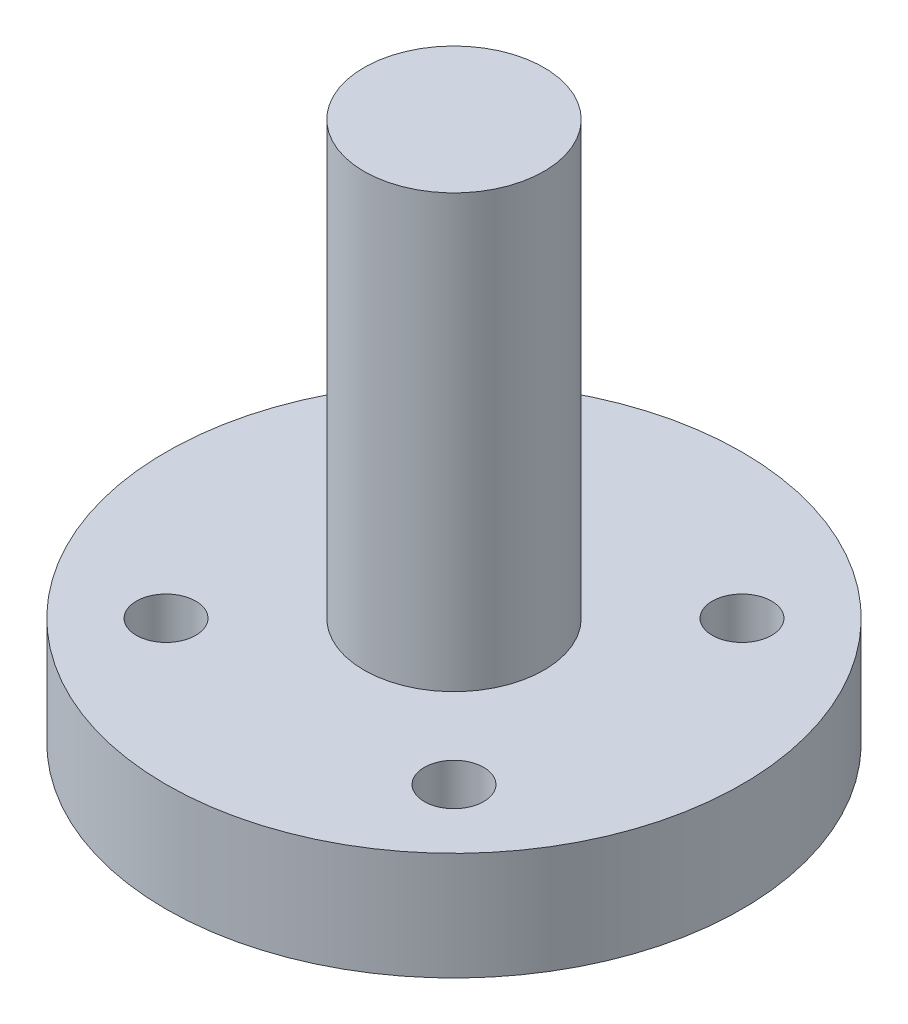
ISO-10303-21;
HEADER;
FILE_DESCRIPTION(('STEP AP214'),'2;1');
FILE_NAME('part.step','',(''),(''),'','','');
FILE_SCHEMA(('AUTOMOTIVE_DESIGN { 1 0 10303 214 1 1 1 1 }'));
ENDSEC;
DATA;
#1=APPLICATION_CONTEXT('core data for automotive mechanical design processes');
#2=APPLICATION_PROTOCOL_DEFINITION('international standard','automotive_design',2000,#1);
#3=PRODUCT_CONTEXT('',#1,'mechanical');
#4=PRODUCT('Part','Part','',(#3));
#5=PRODUCT_RELATED_PRODUCT_CATEGORY('part','',(#4));
#6=PRODUCT_DEFINITION_FORMATION('','',#4);
#7=PRODUCT_DEFINITION_CONTEXT('part definition',#1,'design');
#8=PRODUCT_DEFINITION('design','',#6,#7);
#9=PRODUCT_DEFINITION_SHAPE('','',#8);
#10=(LENGTH_UNIT() NAMED_UNIT(*) SI_UNIT(.MILLI.,.METRE.));
#11=(NAMED_UNIT(*) PLANE_ANGLE_UNIT() SI_UNIT($,.RADIAN.));
#12=(NAMED_UNIT(*) SI_UNIT($,.STERADIAN.) SOLID_ANGLE_UNIT());
#13=UNCERTAINTY_MEASURE_WITH_UNIT(LENGTH_MEASURE(1.E-05),#10,'distance_accuracy_value','');
#14=(GEOMETRIC_REPRESENTATION_CONTEXT(3) GLOBAL_UNCERTAINTY_ASSIGNED_CONTEXT((#13)) GLOBAL_UNIT_ASSIGNED_CONTEXT((#10,
#11,#12)) REPRESENTATION_CONTEXT('',''));
#15=CARTESIAN_POINT('',(0.,0.,0.));
#16=DIRECTION('',(0.,0.,1.));
#17=DIRECTION('',(1.,0.,0.));
#18=AXIS2_PLACEMENT_3D('',#15,#16,#17);
#19=CARTESIAN_POINT('',(0.,6.,0.));
#20=DIRECTION('',(0.,1.,0.));
#21=DIRECTION('',(0.,0.,1.));
#22=AXIS2_PLACEMENT_3D('',#19,#20,#21);
#23=PLANE('',#22);
#24=CARTESIAN_POINT('',(0.,6.,0.));
#25=DIRECTION('',(0.,1.,0.));
#26=DIRECTION('',(0.,0.,1.));
#27=AXIS2_PLACEMENT_3D('',#24,#25,#26);
#28=CIRCLE('',#27,5.);
#29=CARTESIAN_POINT('',(0.,6.,5.));
#30=VERTEX_POINT('',#29);
#31=EDGE_CURVE('E10',#30,#30,#28,.T.);
#32=ORIENTED_EDGE('',*,*,#31,.F.);
#33=EDGE_LOOP('',(#32));
#34=FACE_BOUND('',#33,.T.);
#35=CARTESIAN_POINT('',(8.,6.,-8.));
#36=DIRECTION('',(0.,-1.,0.));
#37=DIRECTION('',(0.,0.,-1.));
#38=AXIS2_PLACEMENT_3D('',#35,#36,#37);
#39=CIRCLE('',#38,1.65);
#40=CARTESIAN_POINT('',(8.,6.,-9.65));
#41=VERTEX_POINT('',#40);
#42=EDGE_CURVE('E56',#41,#41,#39,.T.);
#43=ORIENTED_EDGE('',*,*,#42,.T.);
#44=EDGE_LOOP('',(#43));
#45=FACE_BOUND('',#44,.T.);
#46=CARTESIAN_POINT('',(7.99999999999999,6.,8.));
#47=DIRECTION('',(0.,-1.,0.));
#48=DIRECTION('',(0.,0.,-1.));
#49=AXIS2_PLACEMENT_3D('',#46,#47,#48);
#50=CIRCLE('',#49,1.65);
#51=CARTESIAN_POINT('',(7.99999999999999,6.,6.35));
#52=VERTEX_POINT('',#51);
#53=EDGE_CURVE('E62',#52,#52,#50,.T.);
#54=ORIENTED_EDGE('',*,*,#53,.T.);
#55=EDGE_LOOP('',(#54));
#56=FACE_BOUND('',#55,.T.);
#57=CARTESIAN_POINT('',(-8.,6.,8.));
#58=DIRECTION('',(0.,-1.,0.));
#59=DIRECTION('',(0.,0.,-1.));
#60=AXIS2_PLACEMENT_3D('',#57,#58,#59);
#61=CIRCLE('',#60,1.65);
#62=CARTESIAN_POINT('',(-8.,6.,6.35));
#63=VERTEX_POINT('',#62);
#64=EDGE_CURVE('E68',#63,#63,#61,.T.);
#65=ORIENTED_EDGE('',*,*,#64,.T.);
#66=EDGE_LOOP('',(#65));
#67=FACE_BOUND('',#66,.T.);
#68=CARTESIAN_POINT('',(0.,6.,0.));
#69=DIRECTION('',(0.,1.,0.));
#70=DIRECTION('',(0.,0.,1.));
#71=AXIS2_PLACEMENT_3D('',#68,#69,#70);
#72=CIRCLE('',#71,16.);
#73=CARTESIAN_POINT('',(0.,6.,16.));
#74=VERTEX_POINT('',#73);
#75=EDGE_CURVE('E45',#74,#74,#72,.T.);
#76=ORIENTED_EDGE('',*,*,#75,.T.);
#77=EDGE_LOOP('',(#76));
#78=FACE_BOUND('',#77,.T.);
#79=CARTESIAN_POINT('',(-8.,6.,-8.));
#80=DIRECTION('',(0.,-1.,0.));
#81=DIRECTION('',(0.,0.,-1.));
#82=AXIS2_PLACEMENT_3D('',#79,#80,#81);
#83=CIRCLE('',#82,1.65);
#84=CARTESIAN_POINT('',(-8.,6.,-9.65));
#85=VERTEX_POINT('',#84);
#86=EDGE_CURVE('E74',#85,#85,#83,.T.);
#87=ORIENTED_EDGE('',*,*,#86,.T.);
#88=EDGE_LOOP('',(#87));
#89=FACE_BOUND('',#88,.T.);
#90=ADVANCED_FACE('F37',(#34,#45,#56,#67,#78,#89),#23,.T.);
#91=CARTESIAN_POINT('',(0.,6.,0.));
#92=DIRECTION('',(0.,-1.,0.));
#93=DIRECTION('',(0.,0.,-1.));
#94=AXIS2_PLACEMENT_3D('',#91,#92,#93);
#95=CYLINDRICAL_SURFACE('',#94,16.);
#96=ORIENTED_EDGE('',*,*,#75,.F.);
#97=EDGE_LOOP('',(#96));
#98=FACE_BOUND('',#97,.T.);
#99=CARTESIAN_POINT('',(0.,0.,0.));
#100=DIRECTION('',(0.,1.,0.));
#101=DIRECTION('',(0.,0.,1.));
#102=AXIS2_PLACEMENT_3D('',#99,#100,#101);
#103=CIRCLE('',#102,16.);
#104=CARTESIAN_POINT('',(0.,0.,16.));
#105=VERTEX_POINT('',#104);
#106=EDGE_CURVE('E41',#105,#105,#103,.T.);
#107=ORIENTED_EDGE('',*,*,#106,.T.);
#108=EDGE_LOOP('',(#107));
#109=FACE_BOUND('',#108,.T.);
#110=ADVANCED_FACE('F39',(#98,#109),#95,.T.);
#111=CARTESIAN_POINT('',(0.,0.,0.));
#112=DIRECTION('',(0.,1.,0.));
#113=DIRECTION('',(0.,0.,1.));
#114=AXIS2_PLACEMENT_3D('',#111,#112,#113);
#115=PLANE('',#114);
#116=CARTESIAN_POINT('',(8.,0.,-8.));
#117=DIRECTION('',(0.,-1.,0.));
#118=DIRECTION('',(0.,0.,-1.));
#119=AXIS2_PLACEMENT_3D('',#116,#117,#118);
#120=CIRCLE('',#119,1.64999999999999);
#121=CARTESIAN_POINT('',(8.,0.,-9.64999999999999));
#122=VERTEX_POINT('',#121);
#123=EDGE_CURVE('E53',#122,#122,#120,.T.);
#124=ORIENTED_EDGE('',*,*,#123,.F.);
#125=EDGE_LOOP('',(#124));
#126=FACE_BOUND('',#125,.T.);
#127=CARTESIAN_POINT('',(7.99999999999999,0.,8.));
#128=DIRECTION('',(0.,-1.,0.));
#129=DIRECTION('',(0.,0.,-1.));
#130=AXIS2_PLACEMENT_3D('',#127,#128,#129);
#131=CIRCLE('',#130,1.64999999999999);
#132=CARTESIAN_POINT('',(7.99999999999999,0.,6.35000000000001));
#133=VERTEX_POINT('',#132);
#134=EDGE_CURVE('E59',#133,#133,#131,.T.);
#135=ORIENTED_EDGE('',*,*,#134,.F.);
#136=EDGE_LOOP('',(#135));
#137=FACE_BOUND('',#136,.T.);
#138=CARTESIAN_POINT('',(-8.,0.,8.));
#139=DIRECTION('',(0.,-1.,0.));
#140=DIRECTION('',(0.,0.,-1.));
#141=AXIS2_PLACEMENT_3D('',#138,#139,#140);
#142=CIRCLE('',#141,1.64999999999999);
#143=CARTESIAN_POINT('',(-8.,0.,6.35000000000001));
#144=VERTEX_POINT('',#143);
#145=EDGE_CURVE('E65',#144,#144,#142,.T.);
#146=ORIENTED_EDGE('',*,*,#145,.F.);
#147=EDGE_LOOP('',(#146));
#148=FACE_BOUND('',#147,.T.);
#149=CARTESIAN_POINT('',(-8.,0.,-8.));
#150=DIRECTION('',(0.,-1.,0.));
#151=DIRECTION('',(0.,0.,-1.));
#152=AXIS2_PLACEMENT_3D('',#149,#150,#151);
#153=CIRCLE('',#152,1.64999999999999);
#154=CARTESIAN_POINT('',(-8.,0.,-9.64999999999999));
#155=VERTEX_POINT('',#154);
#156=EDGE_CURVE('E71',#155,#155,#153,.T.);
#157=ORIENTED_EDGE('',*,*,#156,.F.);
#158=EDGE_LOOP('',(#157));
#159=FACE_BOUND('',#158,.T.);
#160=ORIENTED_EDGE('',*,*,#106,.F.);
#161=EDGE_LOOP('',(#160));
#162=FACE_BOUND('',#161,.T.);
#163=ADVANCED_FACE('F82',(#126,#137,#148,#159,#162),#115,.F.);
#164=CARTESIAN_POINT('',(-8.,0.,-8.));
#165=DIRECTION('',(0.,-1.,0.));
#166=DIRECTION('',(0.,0.,-1.));
#167=AXIS2_PLACEMENT_3D('',#164,#165,#166);
#168=CYLINDRICAL_SURFACE('',#167,1.64999999999999);
#169=ORIENTED_EDGE('',*,*,#86,.F.);
#170=EDGE_LOOP('',(#169));
#171=FACE_BOUND('',#170,.T.);
#172=ORIENTED_EDGE('',*,*,#156,.T.);
#173=EDGE_LOOP('',(#172));
#174=FACE_BOUND('',#173,.T.);
#175=ADVANCED_FACE('F84',(#171,#174),#168,.F.);
#176=CARTESIAN_POINT('',(-8.,0.,8.));
#177=DIRECTION('',(0.,-1.,0.));
#178=DIRECTION('',(0.,0.,-1.));
#179=AXIS2_PLACEMENT_3D('',#176,#177,#178);
#180=CYLINDRICAL_SURFACE('',#179,1.64999999999999);
#181=ORIENTED_EDGE('',*,*,#64,.F.);
#182=EDGE_LOOP('',(#181));
#183=FACE_BOUND('',#182,.T.);
#184=ORIENTED_EDGE('',*,*,#145,.T.);
#185=EDGE_LOOP('',(#184));
#186=FACE_BOUND('',#185,.T.);
#187=ADVANCED_FACE('F90',(#183,#186),#180,.F.);
#188=CARTESIAN_POINT('',(7.99999999999999,0.,8.));
#189=DIRECTION('',(0.,-1.,0.));
#190=DIRECTION('',(0.,0.,-1.));
#191=AXIS2_PLACEMENT_3D('',#188,#189,#190);
#192=CYLINDRICAL_SURFACE('',#191,1.64999999999999);
#193=ORIENTED_EDGE('',*,*,#53,.F.);
#194=EDGE_LOOP('',(#193));
#195=FACE_BOUND('',#194,.T.);
#196=ORIENTED_EDGE('',*,*,#134,.T.);
#197=EDGE_LOOP('',(#196));
#198=FACE_BOUND('',#197,.T.);
#199=ADVANCED_FACE('F105',(#195,#198),#192,.F.);
#200=CARTESIAN_POINT('',(8.,0.,-8.));
#201=DIRECTION('',(0.,-1.,0.));
#202=DIRECTION('',(0.,0.,-1.));
#203=AXIS2_PLACEMENT_3D('',#200,#201,#202);
#204=CYLINDRICAL_SURFACE('',#203,1.64999999999999);
#205=ORIENTED_EDGE('',*,*,#42,.F.);
#206=EDGE_LOOP('',(#205));
#207=FACE_BOUND('',#206,.T.);
#208=ORIENTED_EDGE('',*,*,#123,.T.);
#209=EDGE_LOOP('',(#208));
#210=FACE_BOUND('',#209,.T.);
#211=ADVANCED_FACE('F109',(#207,#210),#204,.F.);
#212=CARTESIAN_POINT('',(0.,30.,0.));
#213=DIRECTION('',(0.,-1.,0.));
#214=DIRECTION('',(0.,0.,-1.));
#215=AXIS2_PLACEMENT_3D('',#212,#213,#214);
#216=CYLINDRICAL_SURFACE('',#215,5.);
#217=CARTESIAN_POINT('',(0.,30.,0.));
#218=DIRECTION('',(0.,1.,0.));
#219=DIRECTION('',(0.,0.,1.));
#220=AXIS2_PLACEMENT_3D('',#217,#218,#219);
#221=CIRCLE('',#220,5.);
#222=CARTESIAN_POINT('',(0.,30.,5.));
#223=VERTEX_POINT('',#222);
#224=EDGE_CURVE('E52',#223,#223,#221,.T.);
#225=ORIENTED_EDGE('',*,*,#224,.F.);
#226=EDGE_LOOP('',(#225));
#227=FACE_BOUND('',#226,.T.);
#228=ORIENTED_EDGE('',*,*,#31,.T.);
#229=EDGE_LOOP('',(#228));
#230=FACE_BOUND('',#229,.T.);
#231=ADVANCED_FACE('F113',(#227,#230),#216,.T.);
#232=CARTESIAN_POINT('',(0.,30.,0.));
#233=DIRECTION('',(0.,1.,0.));
#234=DIRECTION('',(0.,0.,1.));
#235=AXIS2_PLACEMENT_3D('',#232,#233,#234);
#236=PLANE('',#235);
#237=ORIENTED_EDGE('',*,*,#224,.T.);
#238=EDGE_LOOP('',(#237));
#239=FACE_BOUND('',#238,.T.);
#240=ADVANCED_FACE('F117',(#239),#236,.T.);
#241=CLOSED_SHELL('',(#90,#110,#163,#175,#187,#199,#211,#231,#240));
#242=MANIFOLD_SOLID_BREP('B2',#241);
#243=ADVANCED_BREP_SHAPE_REPRESENTATION('',(#18,#242),#14);
#244=SHAPE_DEFINITION_REPRESENTATION(#9,#243);
ENDSEC;
END-ISO-10303-21;
